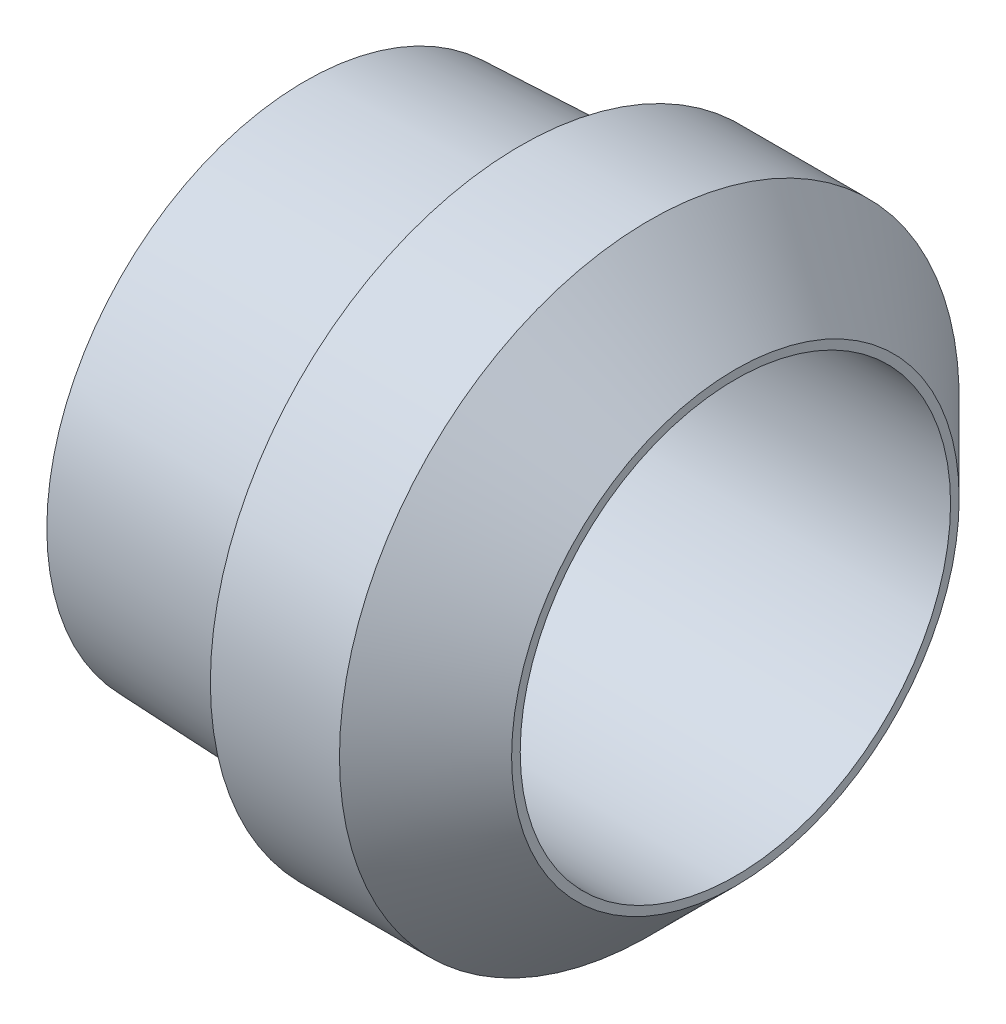
ISO-10303-21;
HEADER;
FILE_DESCRIPTION(('STEP AP214'),'2;1');
FILE_NAME('part.step','',(''),(''),'','','');
FILE_SCHEMA(('AUTOMOTIVE_DESIGN { 1 0 10303 214 1 1 1 1 }'));
ENDSEC;
DATA;
#1=APPLICATION_CONTEXT('core data for automotive mechanical design processes');
#2=APPLICATION_PROTOCOL_DEFINITION('international standard','automotive_design',2000,#1);
#3=PRODUCT_CONTEXT('',#1,'mechanical');
#4=PRODUCT('Part','Part','',(#3));
#5=PRODUCT_RELATED_PRODUCT_CATEGORY('part','',(#4));
#6=PRODUCT_DEFINITION_FORMATION('','',#4);
#7=PRODUCT_DEFINITION_CONTEXT('part definition',#1,'design');
#8=PRODUCT_DEFINITION('design','',#6,#7);
#9=PRODUCT_DEFINITION_SHAPE('','',#8);
#10=(LENGTH_UNIT() NAMED_UNIT(*) SI_UNIT(.MILLI.,.METRE.));
#11=(NAMED_UNIT(*) PLANE_ANGLE_UNIT() SI_UNIT($,.RADIAN.));
#12=(NAMED_UNIT(*) SI_UNIT($,.STERADIAN.) SOLID_ANGLE_UNIT());
#13=UNCERTAINTY_MEASURE_WITH_UNIT(LENGTH_MEASURE(1.E-05),#10,'distance_accuracy_value','');
#14=(GEOMETRIC_REPRESENTATION_CONTEXT(3) GLOBAL_UNCERTAINTY_ASSIGNED_CONTEXT((#13)) GLOBAL_UNIT_ASSIGNED_CONTEXT((#10,
#11,#12)) REPRESENTATION_CONTEXT('',''));
#15=CARTESIAN_POINT('',(0.,0.,0.));
#16=DIRECTION('',(0.,0.,1.));
#17=DIRECTION('',(1.,0.,0.));
#18=AXIS2_PLACEMENT_3D('',#15,#16,#17);
#19=CARTESIAN_POINT('',(-12.,0.,0.));
#20=DIRECTION('',(-1.,0.,0.));
#21=DIRECTION('',(0.,0.,1.));
#22=AXIS2_PLACEMENT_3D('',#19,#20,#21);
#23=CYLINDRICAL_SURFACE('',#22,5.);
#24=CARTESIAN_POINT('',(10.,0.,0.));
#25=DIRECTION('',(-1.,0.,0.));
#26=DIRECTION('',(0.,0.,1.));
#27=AXIS2_PLACEMENT_3D('',#24,#25,#26);
#28=CIRCLE('',#27,5.);
#29=CARTESIAN_POINT('',(10.,0.,5.));
#30=VERTEX_POINT('',#29);
#31=EDGE_CURVE('E62',#30,#30,#28,.T.);
#32=ORIENTED_EDGE('',*,*,#31,.F.);
#33=EDGE_LOOP('',(#32));
#34=FACE_BOUND('',#33,.T.);
#35=CARTESIAN_POINT('',(0.,0.,0.));
#36=DIRECTION('',(-1.,0.,0.));
#37=DIRECTION('',(0.,0.,1.));
#38=AXIS2_PLACEMENT_3D('',#35,#36,#37);
#39=CIRCLE('',#38,5.);
#40=CARTESIAN_POINT('',(0.,0.,5.));
#41=VERTEX_POINT('',#40);
#42=EDGE_CURVE('E10',#41,#41,#39,.T.);
#43=ORIENTED_EDGE('',*,*,#42,.T.);
#44=EDGE_LOOP('',(#43));
#45=FACE_BOUND('',#44,.T.);
#46=ADVANCED_FACE('F37',(#34,#45),#23,.F.);
#47=CARTESIAN_POINT('',(0.,5.,0.));
#48=DIRECTION('',(1.,0.,0.));
#49=DIRECTION('',(0.,0.,-1.));
#50=AXIS2_PLACEMENT_3D('',#47,#48,#49);
#51=PLANE('',#50);
#52=ORIENTED_EDGE('',*,*,#42,.F.);
#53=EDGE_LOOP('',(#52));
#54=FACE_BOUND('',#53,.T.);
#55=CARTESIAN_POINT('',(0.,0.,0.));
#56=DIRECTION('',(-1.,0.,0.));
#57=DIRECTION('',(0.,0.,1.));
#58=AXIS2_PLACEMENT_3D('',#55,#56,#57);
#59=CIRCLE('',#58,6.);
#60=CARTESIAN_POINT('',(0.,0.,6.));
#61=VERTEX_POINT('',#60);
#62=EDGE_CURVE('E43',#61,#61,#59,.T.);
#63=ORIENTED_EDGE('',*,*,#62,.T.);
#64=EDGE_LOOP('',(#63));
#65=FACE_BOUND('',#64,.T.);
#66=ADVANCED_FACE('F69',(#54,#65),#51,.F.);
#67=CARTESIAN_POINT('',(5.,0.,0.));
#68=DIRECTION('',(1.,0.,0.));
#69=DIRECTION('',(0.,0.,-1.));
#70=AXIS2_PLACEMENT_3D('',#67,#68,#69);
#71=CONICAL_SURFACE('',#70,6.2,0.0399786871232903);
#72=ORIENTED_EDGE('',*,*,#62,.F.);
#73=EDGE_LOOP('',(#72));
#74=FACE_BOUND('',#73,.T.);
#75=CARTESIAN_POINT('',(5.,0.,0.));
#76=DIRECTION('',(-1.,0.,0.));
#77=DIRECTION('',(0.,0.,1.));
#78=AXIS2_PLACEMENT_3D('',#75,#76,#77);
#79=CIRCLE('',#78,6.2);
#80=CARTESIAN_POINT('',(5.,0.,6.2));
#81=VERTEX_POINT('',#80);
#82=EDGE_CURVE('E47',#81,#81,#79,.T.);
#83=ORIENTED_EDGE('',*,*,#82,.T.);
#84=EDGE_LOOP('',(#83));
#85=FACE_BOUND('',#84,.T.);
#86=ADVANCED_FACE('F73',(#74,#85),#71,.T.);
#87=CARTESIAN_POINT('',(5.,6.2,0.));
#88=DIRECTION('',(1.,0.,0.));
#89=DIRECTION('',(0.,0.,-1.));
#90=AXIS2_PLACEMENT_3D('',#87,#88,#89);
#91=PLANE('',#90);
#92=ORIENTED_EDGE('',*,*,#82,.F.);
#93=EDGE_LOOP('',(#92));
#94=FACE_BOUND('',#93,.T.);
#95=CARTESIAN_POINT('',(5.,0.,0.));
#96=DIRECTION('',(-1.,0.,0.));
#97=DIRECTION('',(0.,0.,1.));
#98=AXIS2_PLACEMENT_3D('',#95,#96,#97);
#99=CIRCLE('',#98,7.2);
#100=CARTESIAN_POINT('',(5.,0.,7.2));
#101=VERTEX_POINT('',#100);
#102=EDGE_CURVE('E51',#101,#101,#99,.T.);
#103=ORIENTED_EDGE('',*,*,#102,.T.);
#104=EDGE_LOOP('',(#103));
#105=FACE_BOUND('',#104,.T.);
#106=ADVANCED_FACE('F78',(#94,#105),#91,.F.);
#107=CARTESIAN_POINT('',(-12.,0.,0.));
#108=DIRECTION('',(-1.,0.,0.));
#109=DIRECTION('',(0.,0.,1.));
#110=AXIS2_PLACEMENT_3D('',#107,#108,#109);
#111=CYLINDRICAL_SURFACE('',#110,7.2);
#112=ORIENTED_EDGE('',*,*,#102,.F.);
#113=EDGE_LOOP('',(#112));
#114=FACE_BOUND('',#113,.T.);
#115=CARTESIAN_POINT('',(8.00000000000001,0.,0.));
#116=DIRECTION('',(-1.,0.,0.));
#117=DIRECTION('',(0.,0.,1.));
#118=AXIS2_PLACEMENT_3D('',#115,#116,#117);
#119=CIRCLE('',#118,7.2);
#120=CARTESIAN_POINT('',(8.00000000000001,0.,7.2));
#121=VERTEX_POINT('',#120);
#122=EDGE_CURVE('E56',#121,#121,#119,.T.);
#123=ORIENTED_EDGE('',*,*,#122,.T.);
#124=EDGE_LOOP('',(#123));
#125=FACE_BOUND('',#124,.T.);
#126=ADVANCED_FACE('F84',(#114,#125),#111,.T.);
#127=CARTESIAN_POINT('',(10.,0.,0.));
#128=DIRECTION('',(-1.,0.,0.));
#129=DIRECTION('',(0.,0.,1.));
#130=AXIS2_PLACEMENT_3D('',#127,#128,#129);
#131=CONICAL_SURFACE('',#130,5.19999999999999,0.78539816339745);
#132=ORIENTED_EDGE('',*,*,#122,.F.);
#133=EDGE_LOOP('',(#132));
#134=FACE_BOUND('',#133,.T.);
#135=CARTESIAN_POINT('',(10.,0.,0.));
#136=DIRECTION('',(-1.,0.,0.));
#137=DIRECTION('',(0.,0.,1.));
#138=AXIS2_PLACEMENT_3D('',#135,#136,#137);
#139=CIRCLE('',#138,5.19999999999999);
#140=CARTESIAN_POINT('',(10.,0.,5.19999999999999));
#141=VERTEX_POINT('',#140);
#142=EDGE_CURVE('E59',#141,#141,#139,.T.);
#143=ORIENTED_EDGE('',*,*,#142,.T.);
#144=EDGE_LOOP('',(#143));
#145=FACE_BOUND('',#144,.T.);
#146=ADVANCED_FACE('F88',(#134,#145),#131,.T.);
#147=CARTESIAN_POINT('',(10.,5.19999999999999,0.));
#148=DIRECTION('',(-1.,0.,0.));
#149=DIRECTION('',(0.,0.,1.));
#150=AXIS2_PLACEMENT_3D('',#147,#148,#149);
#151=PLANE('',#150);
#152=ORIENTED_EDGE('',*,*,#142,.F.);
#153=EDGE_LOOP('',(#152));
#154=FACE_BOUND('',#153,.T.);
#155=ORIENTED_EDGE('',*,*,#31,.T.);
#156=EDGE_LOOP('',(#155));
#157=FACE_BOUND('',#156,.T.);
#158=ADVANCED_FACE('F66',(#154,#157),#151,.F.);
#159=CLOSED_SHELL('',(#46,#66,#86,#106,#126,#146,#158));
#160=MANIFOLD_SOLID_BREP('B2',#159);
#161=ADVANCED_BREP_SHAPE_REPRESENTATION('',(#18,#160),#14);
#162=SHAPE_DEFINITION_REPRESENTATION(#9,#161);
ENDSEC;
END-ISO-10303-21;
